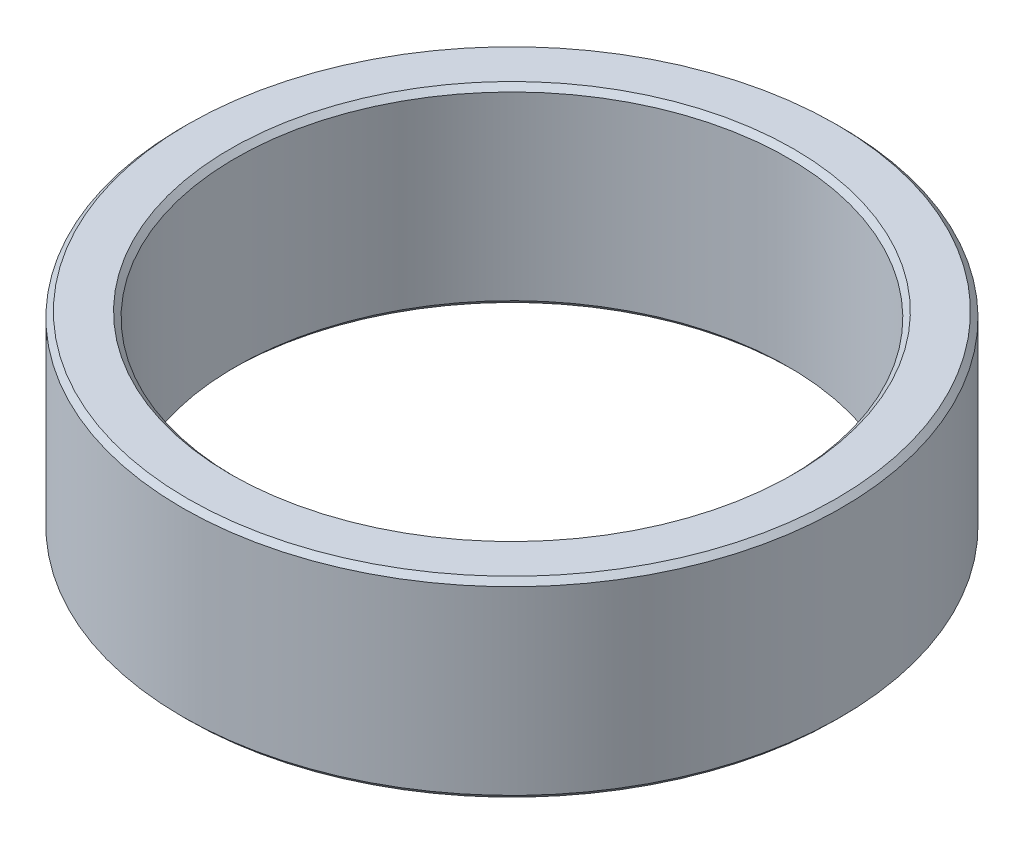
ISO-10303-21;
HEADER;
FILE_DESCRIPTION(('STEP AP214'),'2;1');
FILE_NAME('part.step','',(''),(''),'','','');
FILE_SCHEMA(('AUTOMOTIVE_DESIGN { 1 0 10303 214 1 1 1 1 }'));
ENDSEC;
DATA;
#1=APPLICATION_CONTEXT('core data for automotive mechanical design processes');
#2=APPLICATION_PROTOCOL_DEFINITION('international standard','automotive_design',2000,#1);
#3=PRODUCT_CONTEXT('',#1,'mechanical');
#4=PRODUCT('Part','Part','',(#3));
#5=PRODUCT_RELATED_PRODUCT_CATEGORY('part','',(#4));
#6=PRODUCT_DEFINITION_FORMATION('','',#4);
#7=PRODUCT_DEFINITION_CONTEXT('part definition',#1,'design');
#8=PRODUCT_DEFINITION('design','',#6,#7);
#9=PRODUCT_DEFINITION_SHAPE('','',#8);
#10=(LENGTH_UNIT() NAMED_UNIT(*) SI_UNIT(.MILLI.,.METRE.));
#11=(NAMED_UNIT(*) PLANE_ANGLE_UNIT() SI_UNIT($,.RADIAN.));
#12=(NAMED_UNIT(*) SI_UNIT($,.STERADIAN.) SOLID_ANGLE_UNIT());
#13=UNCERTAINTY_MEASURE_WITH_UNIT(LENGTH_MEASURE(1.E-05),#10,'distance_accuracy_value','');
#14=(GEOMETRIC_REPRESENTATION_CONTEXT(3) GLOBAL_UNCERTAINTY_ASSIGNED_CONTEXT((#13)) GLOBAL_UNIT_ASSIGNED_CONTEXT((#10,
#11,#12)) REPRESENTATION_CONTEXT('',''));
#15=CARTESIAN_POINT('',(0.,0.,0.));
#16=DIRECTION('',(0.,0.,1.));
#17=DIRECTION('',(1.,0.,0.));
#18=AXIS2_PLACEMENT_3D('',#15,#16,#17);
#19=CARTESIAN_POINT('',(0.,18.,0.));
#20=DIRECTION('',(0.,1.,0.));
#21=DIRECTION('',(0.,0.,1.));
#22=AXIS2_PLACEMENT_3D('',#19,#20,#21);
#23=PLANE('',#22);
#24=CARTESIAN_POINT('',(0.,18.,0.));
#25=DIRECTION('',(0.,1.,0.));
#26=DIRECTION('',(0.,0.,1.));
#27=AXIS2_PLACEMENT_3D('',#24,#25,#26);
#28=CIRCLE('',#27,26.5);
#29=CARTESIAN_POINT('',(0.,18.,26.5));
#30=VERTEX_POINT('',#29);
#31=EDGE_CURVE('E10',#30,#30,#28,.F.);
#32=ORIENTED_EDGE('',*,*,#31,.T.);
#33=EDGE_LOOP('',(#32));
#34=FACE_BOUND('',#33,.T.);
#35=CARTESIAN_POINT('',(0.,18.,0.));
#36=DIRECTION('',(0.,1.,0.));
#37=DIRECTION('',(0.,0.,1.));
#38=AXIS2_PLACEMENT_3D('',#35,#36,#37);
#39=CIRCLE('',#38,30.5);
#40=CARTESIAN_POINT('',(0.,18.,30.5));
#41=VERTEX_POINT('',#40);
#42=EDGE_CURVE('E35',#41,#41,#39,.T.);
#43=ORIENTED_EDGE('',*,*,#42,.T.);
#44=EDGE_LOOP('',(#43));
#45=FACE_BOUND('',#44,.T.);
#46=ADVANCED_FACE('F28',(#34,#45),#23,.T.);
#47=CARTESIAN_POINT('',(0.,0.,0.));
#48=DIRECTION('',(0.,1.,0.));
#49=DIRECTION('',(0.,0.,1.));
#50=AXIS2_PLACEMENT_3D('',#47,#48,#49);
#51=PLANE('',#50);
#52=CARTESIAN_POINT('',(0.,0.,0.));
#53=DIRECTION('',(0.,1.,0.));
#54=DIRECTION('',(0.,0.,1.));
#55=AXIS2_PLACEMENT_3D('',#52,#53,#54);
#56=CIRCLE('',#55,26.5);
#57=CARTESIAN_POINT('',(0.,0.,26.5));
#58=VERTEX_POINT('',#57);
#59=EDGE_CURVE('E54',#58,#58,#56,.T.);
#60=ORIENTED_EDGE('',*,*,#59,.T.);
#61=EDGE_LOOP('',(#60));
#62=FACE_BOUND('',#61,.T.);
#63=CARTESIAN_POINT('',(0.,0.,0.));
#64=DIRECTION('',(0.,1.,0.));
#65=DIRECTION('',(0.,0.,1.));
#66=AXIS2_PLACEMENT_3D('',#63,#64,#65);
#67=CIRCLE('',#66,30.5);
#68=CARTESIAN_POINT('',(0.,0.,30.5));
#69=VERTEX_POINT('',#68);
#70=EDGE_CURVE('E57',#69,#69,#67,.F.);
#71=ORIENTED_EDGE('',*,*,#70,.T.);
#72=EDGE_LOOP('',(#71));
#73=FACE_BOUND('',#72,.T.);
#74=ADVANCED_FACE('F61',(#62,#73),#51,.F.);
#75=CARTESIAN_POINT('',(0.,18.,0.));
#76=DIRECTION('',(0.,-1.,0.));
#77=DIRECTION('',(0.,0.,-1.));
#78=AXIS2_PLACEMENT_3D('',#75,#76,#77);
#79=CYLINDRICAL_SURFACE('',#78,31.);
#80=CARTESIAN_POINT('',(0.,0.500000000000011,0.));
#81=DIRECTION('',(0.,1.,0.));
#82=DIRECTION('',(0.,0.,1.));
#83=AXIS2_PLACEMENT_3D('',#80,#81,#82);
#84=CIRCLE('',#83,31.);
#85=CARTESIAN_POINT('',(0.,0.500000000000011,31.));
#86=VERTEX_POINT('',#85);
#87=EDGE_CURVE('E39',#86,#86,#84,.T.);
#88=ORIENTED_EDGE('',*,*,#87,.T.);
#89=EDGE_LOOP('',(#88));
#90=FACE_BOUND('',#89,.T.);
#91=CARTESIAN_POINT('',(0.,17.5,0.));
#92=DIRECTION('',(0.,1.,0.));
#93=DIRECTION('',(0.,0.,1.));
#94=AXIS2_PLACEMENT_3D('',#91,#92,#93);
#95=CIRCLE('',#94,31.);
#96=CARTESIAN_POINT('',(0.,17.5,31.));
#97=VERTEX_POINT('',#96);
#98=EDGE_CURVE('E43',#97,#97,#95,.F.);
#99=ORIENTED_EDGE('',*,*,#98,.T.);
#100=EDGE_LOOP('',(#99));
#101=FACE_BOUND('',#100,.T.);
#102=ADVANCED_FACE('F71',(#90,#101),#79,.T.);
#103=CARTESIAN_POINT('',(0.,18.,0.));
#104=DIRECTION('',(0.,-1.,0.));
#105=DIRECTION('',(0.,0.,-1.));
#106=AXIS2_PLACEMENT_3D('',#103,#104,#105);
#107=CYLINDRICAL_SURFACE('',#106,26.);
#108=CARTESIAN_POINT('',(0.,0.500000000000014,0.));
#109=DIRECTION('',(0.,1.,0.));
#110=DIRECTION('',(0.,0.,1.));
#111=AXIS2_PLACEMENT_3D('',#108,#109,#110);
#112=CIRCLE('',#111,26.);
#113=CARTESIAN_POINT('',(0.,0.500000000000014,26.));
#114=VERTEX_POINT('',#113);
#115=EDGE_CURVE('E48',#114,#114,#112,.F.);
#116=ORIENTED_EDGE('',*,*,#115,.T.);
#117=EDGE_LOOP('',(#116));
#118=FACE_BOUND('',#117,.T.);
#119=CARTESIAN_POINT('',(0.,17.5,0.));
#120=DIRECTION('',(0.,1.,0.));
#121=DIRECTION('',(0.,0.,1.));
#122=AXIS2_PLACEMENT_3D('',#119,#120,#121);
#123=CIRCLE('',#122,26.);
#124=CARTESIAN_POINT('',(0.,17.5,26.));
#125=VERTEX_POINT('',#124);
#126=EDGE_CURVE('E51',#125,#125,#123,.T.);
#127=ORIENTED_EDGE('',*,*,#126,.T.);
#128=EDGE_LOOP('',(#127));
#129=FACE_BOUND('',#128,.T.);
#130=ADVANCED_FACE('F74',(#118,#129),#107,.F.);
#131=CARTESIAN_POINT('',(0.,0.,0.));
#132=DIRECTION('',(0.,-1.,0.));
#133=DIRECTION('',(0.,0.,-1.));
#134=AXIS2_PLACEMENT_3D('',#131,#132,#133);
#135=CONICAL_SURFACE('',#134,26.5,0.785398163397441);
#136=ORIENTED_EDGE('',*,*,#115,.F.);
#137=EDGE_LOOP('',(#136));
#138=FACE_BOUND('',#137,.T.);
#139=ORIENTED_EDGE('',*,*,#59,.F.);
#140=EDGE_LOOP('',(#139));
#141=FACE_BOUND('',#140,.T.);
#142=ADVANCED_FACE('F67',(#138,#141),#135,.F.);
#143=CARTESIAN_POINT('',(0.,0.500000000000011,0.));
#144=DIRECTION('',(0.,1.,0.));
#145=DIRECTION('',(0.,0.,1.));
#146=AXIS2_PLACEMENT_3D('',#143,#144,#145);
#147=CONICAL_SURFACE('',#146,31.,0.785398163397445);
#148=ORIENTED_EDGE('',*,*,#70,.F.);
#149=EDGE_LOOP('',(#148));
#150=FACE_BOUND('',#149,.T.);
#151=ORIENTED_EDGE('',*,*,#87,.F.);
#152=EDGE_LOOP('',(#151));
#153=FACE_BOUND('',#152,.T.);
#154=ADVANCED_FACE('F63',(#150,#153),#147,.T.);
#155=CARTESIAN_POINT('',(0.,17.5,0.));
#156=DIRECTION('',(0.,1.,0.));
#157=DIRECTION('',(0.,0.,1.));
#158=AXIS2_PLACEMENT_3D('',#155,#156,#157);
#159=CONICAL_SURFACE('',#158,26.,0.785398163397445);
#160=ORIENTED_EDGE('',*,*,#31,.F.);
#161=EDGE_LOOP('',(#160));
#162=FACE_BOUND('',#161,.T.);
#163=ORIENTED_EDGE('',*,*,#126,.F.);
#164=EDGE_LOOP('',(#163));
#165=FACE_BOUND('',#164,.T.);
#166=ADVANCED_FACE('F66',(#162,#165),#159,.F.);
#167=CARTESIAN_POINT('',(0.,18.,0.));
#168=DIRECTION('',(0.,-1.,0.));
#169=DIRECTION('',(0.,0.,-1.));
#170=AXIS2_PLACEMENT_3D('',#167,#168,#169);
#171=CONICAL_SURFACE('',#170,30.5,0.785398163397438);
#172=ORIENTED_EDGE('',*,*,#98,.F.);
#173=EDGE_LOOP('',(#172));
#174=FACE_BOUND('',#173,.T.);
#175=ORIENTED_EDGE('',*,*,#42,.F.);
#176=EDGE_LOOP('',(#175));
#177=FACE_BOUND('',#176,.T.);
#178=ADVANCED_FACE('F30',(#174,#177),#171,.T.);
#179=CLOSED_SHELL('',(#46,#74,#102,#130,#142,#154,#166,#178));
#180=MANIFOLD_SOLID_BREP('B2',#179);
#181=ADVANCED_BREP_SHAPE_REPRESENTATION('',(#18,#180),#14);
#182=SHAPE_DEFINITION_REPRESENTATION(#9,#181);
ENDSEC;
END-ISO-10303-21;
